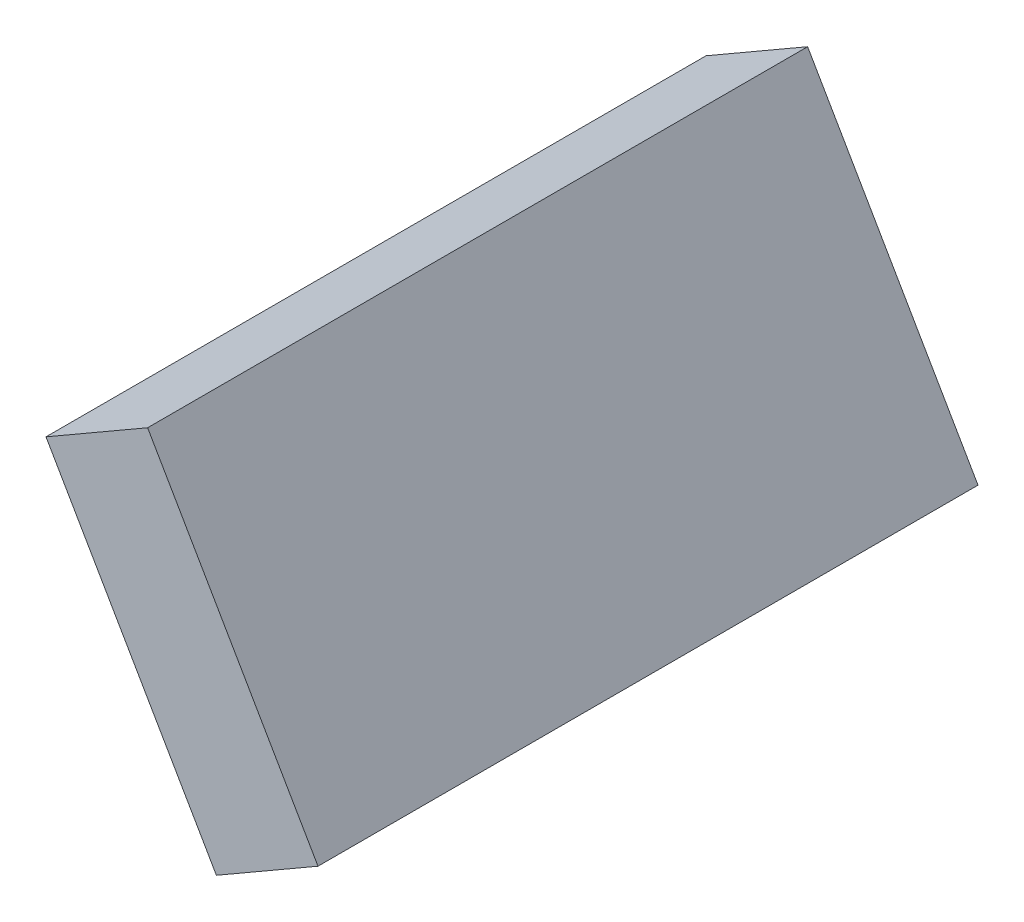
ISO-10303-21;
HEADER;
FILE_DESCRIPTION(('STEP AP214'),'2;1');
FILE_NAME('part.step','',(''),(''),'','','');
FILE_SCHEMA(('AUTOMOTIVE_DESIGN { 1 0 10303 214 1 1 1 1 }'));
ENDSEC;
DATA;
#1=APPLICATION_CONTEXT('core data for automotive mechanical design processes');
#2=APPLICATION_PROTOCOL_DEFINITION('international standard','automotive_design',2000,#1);
#3=PRODUCT_CONTEXT('',#1,'mechanical');
#4=PRODUCT('Part','Part','',(#3));
#5=PRODUCT_RELATED_PRODUCT_CATEGORY('part','',(#4));
#6=PRODUCT_DEFINITION_FORMATION('','',#4);
#7=PRODUCT_DEFINITION_CONTEXT('part definition',#1,'design');
#8=PRODUCT_DEFINITION('design','',#6,#7);
#9=PRODUCT_DEFINITION_SHAPE('','',#8);
#10=(LENGTH_UNIT() NAMED_UNIT(*) SI_UNIT(.MILLI.,.METRE.));
#11=(NAMED_UNIT(*) PLANE_ANGLE_UNIT() SI_UNIT($,.RADIAN.));
#12=(NAMED_UNIT(*) SI_UNIT($,.STERADIAN.) SOLID_ANGLE_UNIT());
#13=UNCERTAINTY_MEASURE_WITH_UNIT(LENGTH_MEASURE(1.E-05),#10,'distance_accuracy_value','');
#14=(GEOMETRIC_REPRESENTATION_CONTEXT(3) GLOBAL_UNCERTAINTY_ASSIGNED_CONTEXT((#13)) GLOBAL_UNIT_ASSIGNED_CONTEXT((#10,
#11,#12)) REPRESENTATION_CONTEXT('',''));
#15=CARTESIAN_POINT('',(0.,0.,0.));
#16=DIRECTION('',(0.,0.,1.));
#17=DIRECTION('',(1.,0.,0.));
#18=AXIS2_PLACEMENT_3D('',#15,#16,#17);
#19=CARTESIAN_POINT('',(-450.47630134902,-260.573962360855,112.5));
#20=DIRECTION('',(0.865616283348474,0.500707948810456,0.));
#21=DIRECTION('',(-0.500707948810456,0.865616283348474,0.));
#22=AXIS2_PLACEMENT_3D('',#19,#20,#21);
#23=PLANE('',#22);
#24=DIRECTION('',(0.500707948810456,-0.865616283348474,0.));
#25=VECTOR('',#24,1.);
#26=CARTESIAN_POINT('',(-450.47630134902,-260.573962360855,0.));
#27=LINE('',#26,#25);
#28=CARTESIAN_POINT('',(-498.325099264696,-177.853688570797,0.));
#29=VERTEX_POINT('',#28);
#30=CARTESIAN_POINT('',(-469.28402852568,-228.059449788068,0.));
#31=VERTEX_POINT('',#30);
#32=EDGE_CURVE('E110',#29,#31,#27,.T.);
#33=ORIENTED_EDGE('',*,*,#32,.F.);
#34=DIRECTION('',(0.,0.,-1.));
#35=VECTOR('',#34,1.);
#36=CARTESIAN_POINT('',(-498.325099264696,-177.853688570797,112.5));
#37=LINE('',#36,#35);
#38=CARTESIAN_POINT('',(-498.325099264696,-177.853688570797,112.5));
#39=VERTEX_POINT('',#38);
#40=EDGE_CURVE('E11',#39,#29,#37,.T.);
#41=ORIENTED_EDGE('',*,*,#40,.F.);
#42=DIRECTION('',(0.500707948810456,-0.865616283348474,0.));
#43=VECTOR('',#42,1.);
#44=CARTESIAN_POINT('',(-450.47630134902,-260.573962360855,112.5));
#45=LINE('',#44,#43);
#46=CARTESIAN_POINT('',(-469.28402852568,-228.059449788068,112.5));
#47=VERTEX_POINT('',#46);
#48=EDGE_CURVE('E101',#39,#47,#45,.T.);
#49=ORIENTED_EDGE('',*,*,#48,.T.);
#50=DIRECTION('',(0.,0.,-1.));
#51=VECTOR('',#50,1.);
#52=CARTESIAN_POINT('',(-469.28402852568,-228.059449788068,112.5));
#53=LINE('',#52,#51);
#54=EDGE_CURVE('E80',#47,#31,#53,.T.);
#55=ORIENTED_EDGE('',*,*,#54,.T.);
#56=EDGE_LOOP('',(#33,#41,#49,#55));
#57=FACE_BOUND('',#56,.T.);
#58=ADVANCED_FACE('F41',(#57),#23,.T.);
#59=CARTESIAN_POINT('',(-47.5683685866355,82.3908312252162,112.5));
#60=DIRECTION('',(-0.5,0.866025403784439,0.));
#61=DIRECTION('',(-0.866025403784439,-0.5,0.));
#62=AXIS2_PLACEMENT_3D('',#59,#60,#61);
#63=PLANE('',#62);
#64=DIRECTION('',(0.866025403784439,0.5,0.));
#65=VECTOR('',#64,1.);
#66=CARTESIAN_POINT('',(-47.5683685866355,82.3908312252162,0.));
#67=LINE('',#66,#65);
#68=CARTESIAN_POINT('',(-515.645607340385,-187.853688570797,0.));
#69=VERTEX_POINT('',#68);
#70=EDGE_CURVE('E93',#69,#29,#67,.T.);
#71=ORIENTED_EDGE('',*,*,#70,.F.);
#72=DIRECTION('',(0.,0.,-1.));
#73=VECTOR('',#72,1.);
#74=CARTESIAN_POINT('',(-515.645607340385,-187.853688570797,112.5));
#75=LINE('',#74,#73);
#76=CARTESIAN_POINT('',(-515.645607340385,-187.853688570797,112.5));
#77=VERTEX_POINT('',#76);
#78=EDGE_CURVE('E50',#77,#69,#75,.T.);
#79=ORIENTED_EDGE('',*,*,#78,.F.);
#80=DIRECTION('',(0.866025403784439,0.5,0.));
#81=VECTOR('',#80,1.);
#82=CARTESIAN_POINT('',(-47.5683685866355,82.3908312252162,112.5));
#83=LINE('',#82,#81);
#84=EDGE_CURVE('E91',#77,#39,#83,.T.);
#85=ORIENTED_EDGE('',*,*,#84,.T.);
#86=ORIENTED_EDGE('',*,*,#40,.T.);
#87=EDGE_LOOP('',(#71,#79,#85,#86));
#88=FACE_BOUND('',#87,.T.);
#89=ADVANCED_FACE('F89',(#88),#63,.T.);
#90=CARTESIAN_POINT('',(-467.78862122873,-270.588117989476,112.5));
#91=DIRECTION('',(0.865616283348474,0.500707948810456,0.));
#92=DIRECTION('',(-0.500707948810456,0.865616283348474,0.));
#93=AXIS2_PLACEMENT_3D('',#90,#91,#92);
#94=PLANE('',#93);
#95=DIRECTION('',(0.500707948810456,-0.865616283348474,0.));
#96=VECTOR('',#95,1.);
#97=CARTESIAN_POINT('',(-467.78862122873,-270.588117989476,0.));
#98=LINE('',#97,#96);
#99=CARTESIAN_POINT('',(-486.604536601369,-238.059449788068,0.));
#100=VERTEX_POINT('',#99);
#101=EDGE_CURVE('E73',#69,#100,#98,.T.);
#102=ORIENTED_EDGE('',*,*,#101,.T.);
#103=DIRECTION('',(0.,0.,-1.));
#104=VECTOR('',#103,1.);
#105=CARTESIAN_POINT('',(-486.604536601369,-238.059449788068,112.5));
#106=LINE('',#105,#104);
#107=CARTESIAN_POINT('',(-486.604536601369,-238.059449788068,112.5));
#108=VERTEX_POINT('',#107);
#109=EDGE_CURVE('E95',#108,#100,#106,.T.);
#110=ORIENTED_EDGE('',*,*,#109,.F.);
#111=DIRECTION('',(0.500707948810456,-0.865616283348474,0.));
#112=VECTOR('',#111,1.);
#113=CARTESIAN_POINT('',(-467.78862122873,-270.588117989476,112.5));
#114=LINE('',#113,#112);
#115=EDGE_CURVE('E96',#77,#108,#114,.T.);
#116=ORIENTED_EDGE('',*,*,#115,.F.);
#117=ORIENTED_EDGE('',*,*,#78,.T.);
#118=EDGE_LOOP('',(#102,#110,#116,#117));
#119=FACE_BOUND('',#118,.T.);
#120=ADVANCED_FACE('F97',(#119),#94,.F.);
#121=CARTESIAN_POINT('',(-18.5683685866356,32.1613578057187,112.5));
#122=DIRECTION('',(-0.5,0.866025403784439,0.));
#123=DIRECTION('',(-0.866025403784439,-0.5,0.));
#124=AXIS2_PLACEMENT_3D('',#121,#122,#123);
#125=PLANE('',#124);
#126=DIRECTION('',(0.866025403784439,0.5,0.));
#127=VECTOR('',#126,1.);
#128=CARTESIAN_POINT('',(-18.5683685866356,32.1613578057187,0.));
#129=LINE('',#128,#127);
#130=EDGE_CURVE('E105',#100,#31,#129,.T.);
#131=ORIENTED_EDGE('',*,*,#130,.T.);
#132=ORIENTED_EDGE('',*,*,#54,.F.);
#133=DIRECTION('',(0.866025403784439,0.5,0.));
#134=VECTOR('',#133,1.);
#135=CARTESIAN_POINT('',(-18.5683685866356,32.1613578057187,112.5));
#136=LINE('',#135,#134);
#137=EDGE_CURVE('E58',#108,#47,#136,.T.);
#138=ORIENTED_EDGE('',*,*,#137,.F.);
#139=ORIENTED_EDGE('',*,*,#109,.T.);
#140=EDGE_LOOP('',(#131,#132,#138,#139));
#141=FACE_BOUND('',#140,.T.);
#142=ADVANCED_FACE('F125',(#141),#125,.F.);
#143=CARTESIAN_POINT('',(0.,0.,112.5));
#144=DIRECTION('',(0.,0.,1.));
#145=DIRECTION('',(1.,0.,0.));
#146=AXIS2_PLACEMENT_3D('',#143,#144,#145);
#147=PLANE('',#146);
#148=ORIENTED_EDGE('',*,*,#48,.F.);
#149=ORIENTED_EDGE('',*,*,#84,.F.);
#150=ORIENTED_EDGE('',*,*,#115,.T.);
#151=ORIENTED_EDGE('',*,*,#137,.T.);
#152=EDGE_LOOP('',(#148,#149,#150,#151));
#153=FACE_BOUND('',#152,.T.);
#154=ADVANCED_FACE('F100',(#153),#147,.T.);
#155=CARTESIAN_POINT('',(0.,0.,0.));
#156=DIRECTION('',(0.,0.,1.));
#157=DIRECTION('',(1.,0.,0.));
#158=AXIS2_PLACEMENT_3D('',#155,#156,#157);
#159=PLANE('',#158);
#160=ORIENTED_EDGE('',*,*,#32,.T.);
#161=ORIENTED_EDGE('',*,*,#130,.F.);
#162=ORIENTED_EDGE('',*,*,#101,.F.);
#163=ORIENTED_EDGE('',*,*,#70,.T.);
#164=EDGE_LOOP('',(#160,#161,#162,#163));
#165=FACE_BOUND('',#164,.T.);
#166=ADVANCED_FACE('F127',(#165),#159,.F.);
#167=CLOSED_SHELL('',(#58,#89,#120,#142,#154,#166));
#168=MANIFOLD_SOLID_BREP('B2',#167);
#169=ADVANCED_BREP_SHAPE_REPRESENTATION('',(#18,#168),#14);
#170=SHAPE_DEFINITION_REPRESENTATION(#9,#169);
ENDSEC;
END-ISO-10303-21;
